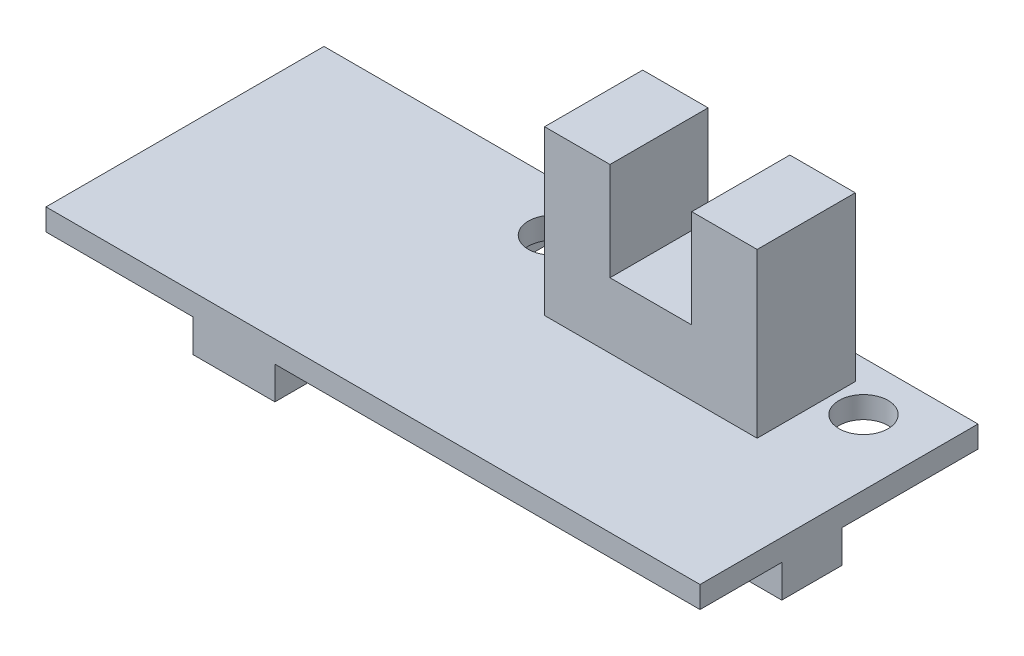
ISO-10303-21;
HEADER;
FILE_DESCRIPTION(('STEP AP214'),'2;1');
FILE_NAME('part.step','',(''),(''),'','','');
FILE_SCHEMA(('AUTOMOTIVE_DESIGN { 1 0 10303 214 1 1 1 1 }'));
ENDSEC;
DATA;
#1=APPLICATION_CONTEXT('core data for automotive mechanical design processes');
#2=APPLICATION_PROTOCOL_DEFINITION('international standard','automotive_design',2000,#1);
#3=PRODUCT_CONTEXT('',#1,'mechanical');
#4=PRODUCT('Part','Part','',(#3));
#5=PRODUCT_RELATED_PRODUCT_CATEGORY('part','',(#4));
#6=PRODUCT_DEFINITION_FORMATION('','',#4);
#7=PRODUCT_DEFINITION_CONTEXT('part definition',#1,'design');
#8=PRODUCT_DEFINITION('design','',#6,#7);
#9=PRODUCT_DEFINITION_SHAPE('','',#8);
#10=(LENGTH_UNIT() NAMED_UNIT(*) SI_UNIT(.MILLI.,.METRE.));
#11=(NAMED_UNIT(*) PLANE_ANGLE_UNIT() SI_UNIT($,.RADIAN.));
#12=(NAMED_UNIT(*) SI_UNIT($,.STERADIAN.) SOLID_ANGLE_UNIT());
#13=UNCERTAINTY_MEASURE_WITH_UNIT(LENGTH_MEASURE(1.E-05),#10,'distance_accuracy_value','');
#14=(GEOMETRIC_REPRESENTATION_CONTEXT(3) GLOBAL_UNCERTAINTY_ASSIGNED_CONTEXT((#13)) GLOBAL_UNIT_ASSIGNED_CONTEXT((#10,
#11,#12)) REPRESENTATION_CONTEXT('',''));
#15=CARTESIAN_POINT('',(0.,0.,0.));
#16=DIRECTION('',(0.,0.,1.));
#17=DIRECTION('',(1.,0.,0.));
#18=AXIS2_PLACEMENT_3D('',#15,#16,#17);
#19=CARTESIAN_POINT('',(0.,1.33,0.));
#20=DIRECTION('',(0.,1.,0.));
#21=DIRECTION('',(0.,0.,1.));
#22=AXIS2_PLACEMENT_3D('',#19,#20,#21);
#23=PLANE('',#22);
#24=CARTESIAN_POINT('',(-2.99999999999998,1.33,-5.5));
#25=DIRECTION('',(0.,-1.,0.));
#26=DIRECTION('',(0.,0.,-1.));
#27=AXIS2_PLACEMENT_3D('',#24,#25,#26);
#28=CIRCLE('',#27,1.5);
#29=CARTESIAN_POINT('',(-2.99999999999998,1.33,-7.));
#30=VERTEX_POINT('',#29);
#31=EDGE_CURVE('E255',#30,#30,#28,.T.);
#32=ORIENTED_EDGE('',*,*,#31,.T.);
#33=EDGE_LOOP('',(#32));
#34=FACE_BOUND('',#33,.T.);
#35=CARTESIAN_POINT('',(16.,1.33,-5.5));
#36=DIRECTION('',(0.,-1.,0.));
#37=DIRECTION('',(0.,0.,-1.));
#38=AXIS2_PLACEMENT_3D('',#35,#36,#37);
#39=CIRCLE('',#38,1.5);
#40=CARTESIAN_POINT('',(16.,1.33,-7.));
#41=VERTEX_POINT('',#40);
#42=EDGE_CURVE('E261',#41,#41,#39,.T.);
#43=ORIENTED_EDGE('',*,*,#42,.T.);
#44=EDGE_LOOP('',(#43));
#45=FACE_BOUND('',#44,.T.);
#46=DIRECTION('',(0.,0.,-1.));
#47=VECTOR('',#46,1.);
#48=CARTESIAN_POINT('',(20.,1.33,-8.5));
#49=LINE('',#48,#47);
#50=CARTESIAN_POINT('',(20.,1.33,8.5));
#51=VERTEX_POINT('',#50);
#52=CARTESIAN_POINT('',(20.,1.33,-8.5));
#53=VERTEX_POINT('',#52);
#54=EDGE_CURVE('E338',#51,#53,#49,.T.);
#55=ORIENTED_EDGE('',*,*,#54,.T.);
#56=DIRECTION('',(-1.,0.,0.));
#57=VECTOR('',#56,1.);
#58=CARTESIAN_POINT('',(-20.,1.33,-8.5));
#59=LINE('',#58,#57);
#60=CARTESIAN_POINT('',(-20.,1.33,-8.5));
#61=VERTEX_POINT('',#60);
#62=EDGE_CURVE('E341',#53,#61,#59,.T.);
#63=ORIENTED_EDGE('',*,*,#62,.T.);
#64=DIRECTION('',(0.,0.,1.));
#65=VECTOR('',#64,1.);
#66=CARTESIAN_POINT('',(-20.,1.33,-8.5));
#67=LINE('',#66,#65);
#68=CARTESIAN_POINT('',(-20.,1.33,8.5));
#69=VERTEX_POINT('',#68);
#70=EDGE_CURVE('E344',#61,#69,#67,.T.);
#71=ORIENTED_EDGE('',*,*,#70,.T.);
#72=DIRECTION('',(1.,0.,0.));
#73=VECTOR('',#72,1.);
#74=CARTESIAN_POINT('',(-20.,1.33,8.5));
#75=LINE('',#74,#73);
#76=EDGE_CURVE('E346',#69,#51,#75,.T.);
#77=ORIENTED_EDGE('',*,*,#76,.T.);
#78=EDGE_LOOP('',(#55,#63,#71,#77));
#79=FACE_BOUND('',#78,.T.);
#80=DIRECTION('',(0.,0.,1.));
#81=VECTOR('',#80,1.);
#82=CARTESIAN_POINT('',(1.00000000000002,1.33,-6.99296777077052));
#83=LINE('',#82,#81);
#84=CARTESIAN_POINT('',(1.00000000000002,1.33,-6.99296777077052));
#85=VERTEX_POINT('',#84);
#86=CARTESIAN_POINT('',(1.00000000000002,1.33,-0.992967770770519));
#87=VERTEX_POINT('',#86);
#88=EDGE_CURVE('E220',#85,#87,#83,.T.);
#89=ORIENTED_EDGE('',*,*,#88,.F.);
#90=DIRECTION('',(-1.,0.,0.));
#91=VECTOR('',#90,1.);
#92=CARTESIAN_POINT('',(14.,1.33,-6.99296777077052));
#93=LINE('',#92,#91);
#94=CARTESIAN_POINT('',(14.,1.33,-6.99296777077052));
#95=VERTEX_POINT('',#94);
#96=EDGE_CURVE('E228',#95,#85,#93,.T.);
#97=ORIENTED_EDGE('',*,*,#96,.F.);
#98=DIRECTION('',(0.,0.,-1.));
#99=VECTOR('',#98,1.);
#100=CARTESIAN_POINT('',(14.,1.33,-6.99296777077052));
#101=LINE('',#100,#99);
#102=CARTESIAN_POINT('',(14.,1.33,-0.99296777077052));
#103=VERTEX_POINT('',#102);
#104=EDGE_CURVE('E225',#103,#95,#101,.T.);
#105=ORIENTED_EDGE('',*,*,#104,.F.);
#106=DIRECTION('',(1.,0.,0.));
#107=VECTOR('',#106,1.);
#108=CARTESIAN_POINT('',(14.,1.33,-0.99296777077052));
#109=LINE('',#108,#107);
#110=EDGE_CURVE('E238',#87,#103,#109,.T.);
#111=ORIENTED_EDGE('',*,*,#110,.F.);
#112=EDGE_LOOP('',(#89,#97,#105,#111));
#113=FACE_BOUND('',#112,.T.);
#114=ADVANCED_FACE('F61',(#34,#45,#79,#113),#23,.T.);
#115=CARTESIAN_POINT('',(10.,11.33,-6.99296777077052));
#116=DIRECTION('',(1.,0.,0.));
#117=DIRECTION('',(0.,0.,-1.));
#118=AXIS2_PLACEMENT_3D('',#115,#116,#117);
#119=PLANE('',#118);
#120=DIRECTION('',(0.,0.,-1.));
#121=VECTOR('',#120,1.);
#122=CARTESIAN_POINT('',(10.,5.33,-6.99296777077052));
#123=LINE('',#122,#121);
#124=CARTESIAN_POINT('',(10.,5.33,-0.99296777077052));
#125=VERTEX_POINT('',#124);
#126=CARTESIAN_POINT('',(10.,5.33,-6.99296777077052));
#127=VERTEX_POINT('',#126);
#128=EDGE_CURVE('E83',#125,#127,#123,.T.);
#129=ORIENTED_EDGE('',*,*,#128,.F.);
#130=DIRECTION('',(0.,-1.,0.));
#131=VECTOR('',#130,1.);
#132=CARTESIAN_POINT('',(10.,11.33,-0.99296777077052));
#133=LINE('',#132,#131);
#134=CARTESIAN_POINT('',(10.,11.33,-0.99296777077052));
#135=VERTEX_POINT('',#134);
#136=EDGE_CURVE('E249',#135,#125,#133,.T.);
#137=ORIENTED_EDGE('',*,*,#136,.F.);
#138=DIRECTION('',(0.,0.,1.));
#139=VECTOR('',#138,1.);
#140=CARTESIAN_POINT('',(10.,11.33,-6.99296777077052));
#141=LINE('',#140,#139);
#142=CARTESIAN_POINT('',(10.,11.33,-6.99296777077052));
#143=VERTEX_POINT('',#142);
#144=EDGE_CURVE('E240',#143,#135,#141,.T.);
#145=ORIENTED_EDGE('',*,*,#144,.F.);
#146=DIRECTION('',(0.,-1.,0.));
#147=VECTOR('',#146,1.);
#148=CARTESIAN_POINT('',(10.,11.33,-6.99296777077052));
#149=LINE('',#148,#147);
#150=EDGE_CURVE('E78',#143,#127,#149,.T.);
#151=ORIENTED_EDGE('',*,*,#150,.T.);
#152=EDGE_LOOP('',(#129,#137,#145,#151));
#153=FACE_BOUND('',#152,.T.);
#154=ADVANCED_FACE('F436',(#153),#119,.F.);
#155=CARTESIAN_POINT('',(5.00000000000002,11.33,-6.99296777077052));
#156=DIRECTION('',(-1.,0.,0.));
#157=DIRECTION('',(0.,0.,1.));
#158=AXIS2_PLACEMENT_3D('',#155,#156,#157);
#159=PLANE('',#158);
#160=DIRECTION('',(0.,0.,1.));
#161=VECTOR('',#160,1.);
#162=CARTESIAN_POINT('',(5.00000000000002,5.33,-6.99296777077052));
#163=LINE('',#162,#161);
#164=CARTESIAN_POINT('',(5.00000000000002,5.33,-6.99296777077052));
#165=VERTEX_POINT('',#164);
#166=CARTESIAN_POINT('',(5.00000000000002,5.33,-0.992967770770519));
#167=VERTEX_POINT('',#166);
#168=EDGE_CURVE('E224',#165,#167,#163,.T.);
#169=ORIENTED_EDGE('',*,*,#168,.F.);
#170=DIRECTION('',(0.,-1.,0.));
#171=VECTOR('',#170,1.);
#172=CARTESIAN_POINT('',(5.00000000000002,11.33,-6.99296777077052));
#173=LINE('',#172,#171);
#174=CARTESIAN_POINT('',(5.00000000000002,11.33,-6.99296777077052));
#175=VERTEX_POINT('',#174);
#176=EDGE_CURVE('E205',#175,#165,#173,.T.);
#177=ORIENTED_EDGE('',*,*,#176,.F.);
#178=DIRECTION('',(0.,0.,-1.));
#179=VECTOR('',#178,1.);
#180=CARTESIAN_POINT('',(5.00000000000002,11.33,-6.99296777077052));
#181=LINE('',#180,#179);
#182=CARTESIAN_POINT('',(5.00000000000002,11.33,-0.992967770770519));
#183=VERTEX_POINT('',#182);
#184=EDGE_CURVE('E212',#183,#175,#181,.T.);
#185=ORIENTED_EDGE('',*,*,#184,.F.);
#186=DIRECTION('',(0.,-1.,0.));
#187=VECTOR('',#186,1.);
#188=CARTESIAN_POINT('',(5.00000000000002,11.33,-0.992967770770519));
#189=LINE('',#188,#187);
#190=EDGE_CURVE('E687',#183,#167,#189,.T.);
#191=ORIENTED_EDGE('',*,*,#190,.T.);
#192=EDGE_LOOP('',(#169,#177,#185,#191));
#193=FACE_BOUND('',#192,.T.);
#194=ADVANCED_FACE('F222',(#193),#159,.F.);
#195=CARTESIAN_POINT('',(0.,0.,0.));
#196=DIRECTION('',(0.,1.,0.));
#197=DIRECTION('',(0.,0.,1.));
#198=AXIS2_PLACEMENT_3D('',#195,#196,#197);
#199=PLANE('',#198);
#200=DIRECTION('',(0.,0.,1.));
#201=VECTOR('',#200,1.);
#202=CARTESIAN_POINT('',(-5.99999999999998,0.,0.));
#203=LINE('',#202,#201);
#204=CARTESIAN_POINT('',(-5.99999999999997,0.,3.5));
#205=VERTEX_POINT('',#204);
#206=CARTESIAN_POINT('',(-5.99999999999998,0.,8.5));
#207=VERTEX_POINT('',#206);
#208=EDGE_CURVE('E285',#205,#207,#203,.T.);
#209=ORIENTED_EDGE('',*,*,#208,.F.);
#210=DIRECTION('',(-1.,0.,0.));
#211=VECTOR('',#210,1.);
#212=CARTESIAN_POINT('',(20.,0.,3.5));
#213=LINE('',#212,#211);
#214=CARTESIAN_POINT('',(20.,0.,3.5));
#215=VERTEX_POINT('',#214);
#216=EDGE_CURVE('E264',#215,#205,#213,.T.);
#217=ORIENTED_EDGE('',*,*,#216,.F.);
#218=DIRECTION('',(0.,0.,-1.));
#219=VECTOR('',#218,1.);
#220=CARTESIAN_POINT('',(20.,0.,-8.5));
#221=LINE('',#220,#219);
#222=CARTESIAN_POINT('',(20.,0.,8.5));
#223=VERTEX_POINT('',#222);
#224=EDGE_CURVE('E358',#223,#215,#221,.T.);
#225=ORIENTED_EDGE('',*,*,#224,.F.);
#226=DIRECTION('',(1.,0.,0.));
#227=VECTOR('',#226,1.);
#228=CARTESIAN_POINT('',(-20.,0.,8.5));
#229=LINE('',#228,#227);
#230=EDGE_CURVE('E373',#207,#223,#229,.T.);
#231=ORIENTED_EDGE('',*,*,#230,.F.);
#232=EDGE_LOOP('',(#209,#217,#225,#231));
#233=FACE_BOUND('',#232,.T.);
#234=ADVANCED_FACE('F416',(#233),#199,.F.);
#235=DIRECTION('',(-1.,0.,0.));
#236=VECTOR('',#235,1.);
#237=CARTESIAN_POINT('',(-20.,0.,-8.5));
#238=LINE('',#237,#236);
#239=CARTESIAN_POINT('',(-11.,0.,-8.5));
#240=VERTEX_POINT('',#239);
#241=CARTESIAN_POINT('',(-20.,0.,-8.5));
#242=VERTEX_POINT('',#241);
#243=EDGE_CURVE('E360',#240,#242,#238,.T.);
#244=ORIENTED_EDGE('',*,*,#243,.F.);
#245=DIRECTION('',(0.,0.,1.));
#246=VECTOR('',#245,1.);
#247=CARTESIAN_POINT('',(-11.,0.,0.));
#248=LINE('',#247,#246);
#249=CARTESIAN_POINT('',(-11.,0.,8.5));
#250=VERTEX_POINT('',#249);
#251=EDGE_CURVE('E289',#240,#250,#248,.T.);
#252=ORIENTED_EDGE('',*,*,#251,.T.);
#253=CARTESIAN_POINT('',(-20.,0.,8.5));
#254=VERTEX_POINT('',#253);
#255=EDGE_CURVE('E342',#254,#250,#229,.T.);
#256=ORIENTED_EDGE('',*,*,#255,.F.);
#257=DIRECTION('',(0.,0.,1.));
#258=VECTOR('',#257,1.);
#259=CARTESIAN_POINT('',(-20.,0.,-8.5));
#260=LINE('',#259,#258);
#261=EDGE_CURVE('E370',#242,#254,#260,.T.);
#262=ORIENTED_EDGE('',*,*,#261,.F.);
#263=EDGE_LOOP('',(#244,#252,#256,#262));
#264=FACE_BOUND('',#263,.T.);
#265=ADVANCED_FACE('F450',(#264),#199,.F.);
#266=CARTESIAN_POINT('',(20.,1.33,-8.5));
#267=DIRECTION('',(-1.,0.,0.));
#268=DIRECTION('',(0.,0.,1.));
#269=AXIS2_PLACEMENT_3D('',#266,#267,#268);
#270=PLANE('',#269);
#271=ORIENTED_EDGE('',*,*,#224,.T.);
#272=DIRECTION('',(0.,1.,0.));
#273=VECTOR('',#272,1.);
#274=CARTESIAN_POINT('',(20.,-2.,3.5));
#275=LINE('',#274,#273);
#276=CARTESIAN_POINT('',(20.,-2.,3.5));
#277=VERTEX_POINT('',#276);
#278=EDGE_CURVE('E296',#277,#215,#275,.T.);
#279=ORIENTED_EDGE('',*,*,#278,.F.);
#280=DIRECTION('',(0.,0.,1.));
#281=VECTOR('',#280,1.);
#282=CARTESIAN_POINT('',(20.,-2.,-0.189999999999996));
#283=LINE('',#282,#281);
#284=CARTESIAN_POINT('',(20.,-2.,-0.189999999999996));
#285=VERTEX_POINT('',#284);
#286=EDGE_CURVE('E326',#285,#277,#283,.T.);
#287=ORIENTED_EDGE('',*,*,#286,.F.);
#288=DIRECTION('',(0.,1.,0.));
#289=VECTOR('',#288,1.);
#290=CARTESIAN_POINT('',(20.,-2.,-0.189999999999996));
#291=LINE('',#290,#289);
#292=CARTESIAN_POINT('',(20.,0.,-0.189999999999997));
#293=VERTEX_POINT('',#292);
#294=EDGE_CURVE('E312',#285,#293,#291,.T.);
#295=ORIENTED_EDGE('',*,*,#294,.T.);
#296=CARTESIAN_POINT('',(20.,0.,-8.5));
#297=VERTEX_POINT('',#296);
#298=EDGE_CURVE('E355',#293,#297,#221,.T.);
#299=ORIENTED_EDGE('',*,*,#298,.T.);
#300=DIRECTION('',(0.,-1.,0.));
#301=VECTOR('',#300,1.);
#302=CARTESIAN_POINT('',(20.,1.33,-8.5));
#303=LINE('',#302,#301);
#304=EDGE_CURVE('E12',#53,#297,#303,.T.);
#305=ORIENTED_EDGE('',*,*,#304,.F.);
#306=ORIENTED_EDGE('',*,*,#54,.F.);
#307=DIRECTION('',(0.,-1.,0.));
#308=VECTOR('',#307,1.);
#309=CARTESIAN_POINT('',(20.,1.33,8.5));
#310=LINE('',#309,#308);
#311=EDGE_CURVE('E348',#51,#223,#310,.T.);
#312=ORIENTED_EDGE('',*,*,#311,.T.);
#313=EDGE_LOOP('',(#271,#279,#287,#295,#299,#305,#306,#312));
#314=FACE_BOUND('',#313,.T.);
#315=ADVANCED_FACE('F63',(#314),#270,.F.);
#316=CARTESIAN_POINT('',(-20.,1.33,-8.5));
#317=DIRECTION('',(0.,0.,1.));
#318=DIRECTION('',(1.,0.,0.));
#319=AXIS2_PLACEMENT_3D('',#316,#317,#318);
#320=PLANE('',#319);
#321=CARTESIAN_POINT('',(-5.99999999999998,0.,-8.5));
#322=VERTEX_POINT('',#321);
#323=EDGE_CURVE('E380',#297,#322,#238,.T.);
#324=ORIENTED_EDGE('',*,*,#323,.T.);
#325=DIRECTION('',(0.,1.,0.));
#326=VECTOR('',#325,1.);
#327=CARTESIAN_POINT('',(-5.99999999999998,-2.,-8.5));
#328=LINE('',#327,#326);
#329=CARTESIAN_POINT('',(-5.99999999999998,-2.,-8.5));
#330=VERTEX_POINT('',#329);
#331=EDGE_CURVE('E307',#330,#322,#328,.T.);
#332=ORIENTED_EDGE('',*,*,#331,.F.);
#333=DIRECTION('',(1.,0.,0.));
#334=VECTOR('',#333,1.);
#335=CARTESIAN_POINT('',(0.,-2.,-8.5));
#336=LINE('',#335,#334);
#337=CARTESIAN_POINT('',(-11.,-2.,-8.5));
#338=VERTEX_POINT('',#337);
#339=EDGE_CURVE('E270',#338,#330,#336,.T.);
#340=ORIENTED_EDGE('',*,*,#339,.F.);
#341=DIRECTION('',(0.,1.,0.));
#342=VECTOR('',#341,1.);
#343=CARTESIAN_POINT('',(-11.,-2.,-8.5));
#344=LINE('',#343,#342);
#345=EDGE_CURVE('E392',#338,#240,#344,.T.);
#346=ORIENTED_EDGE('',*,*,#345,.T.);
#347=ORIENTED_EDGE('',*,*,#243,.T.);
#348=DIRECTION('',(0.,-1.,0.));
#349=VECTOR('',#348,1.);
#350=CARTESIAN_POINT('',(-20.,1.33,-8.5));
#351=LINE('',#350,#349);
#352=EDGE_CURVE('E70',#61,#242,#351,.T.);
#353=ORIENTED_EDGE('',*,*,#352,.F.);
#354=ORIENTED_EDGE('',*,*,#62,.F.);
#355=ORIENTED_EDGE('',*,*,#304,.T.);
#356=EDGE_LOOP('',(#324,#332,#340,#346,#347,#353,#354,#355));
#357=FACE_BOUND('',#356,.T.);
#358=ADVANCED_FACE('F427',(#357),#320,.F.);
#359=CARTESIAN_POINT('',(-20.,1.33,-8.5));
#360=DIRECTION('',(1.,0.,0.));
#361=DIRECTION('',(0.,0.,-1.));
#362=AXIS2_PLACEMENT_3D('',#359,#360,#361);
#363=PLANE('',#362);
#364=ORIENTED_EDGE('',*,*,#261,.T.);
#365=DIRECTION('',(0.,-1.,0.));
#366=VECTOR('',#365,1.);
#367=CARTESIAN_POINT('',(-20.,1.33,8.5));
#368=LINE('',#367,#366);
#369=EDGE_CURVE('E364',#69,#254,#368,.T.);
#370=ORIENTED_EDGE('',*,*,#369,.F.);
#371=ORIENTED_EDGE('',*,*,#70,.F.);
#372=ORIENTED_EDGE('',*,*,#352,.T.);
#373=EDGE_LOOP('',(#364,#370,#371,#372));
#374=FACE_BOUND('',#373,.T.);
#375=ADVANCED_FACE('F425',(#374),#363,.F.);
#376=CARTESIAN_POINT('',(-20.,1.33,8.5));
#377=DIRECTION('',(0.,0.,-1.));
#378=DIRECTION('',(-1.,0.,0.));
#379=AXIS2_PLACEMENT_3D('',#376,#377,#378);
#380=PLANE('',#379);
#381=ORIENTED_EDGE('',*,*,#255,.T.);
#382=DIRECTION('',(0.,1.,0.));
#383=VECTOR('',#382,1.);
#384=CARTESIAN_POINT('',(-11.,-2.,8.5));
#385=LINE('',#384,#383);
#386=CARTESIAN_POINT('',(-11.,-2.,8.5));
#387=VERTEX_POINT('',#386);
#388=EDGE_CURVE('E299',#387,#250,#385,.T.);
#389=ORIENTED_EDGE('',*,*,#388,.F.);
#390=DIRECTION('',(-1.,0.,0.));
#391=VECTOR('',#390,1.);
#392=CARTESIAN_POINT('',(0.,-2.,8.5));
#393=LINE('',#392,#391);
#394=CARTESIAN_POINT('',(-5.99999999999998,-2.,8.5));
#395=VERTEX_POINT('',#394);
#396=EDGE_CURVE('E276',#395,#387,#393,.T.);
#397=ORIENTED_EDGE('',*,*,#396,.F.);
#398=DIRECTION('',(0.,1.,0.));
#399=VECTOR('',#398,1.);
#400=CARTESIAN_POINT('',(-5.99999999999998,-2.,8.5));
#401=LINE('',#400,#399);
#402=EDGE_CURVE('E302',#395,#207,#401,.T.);
#403=ORIENTED_EDGE('',*,*,#402,.T.);
#404=ORIENTED_EDGE('',*,*,#230,.T.);
#405=ORIENTED_EDGE('',*,*,#311,.F.);
#406=ORIENTED_EDGE('',*,*,#76,.F.);
#407=ORIENTED_EDGE('',*,*,#369,.T.);
#408=EDGE_LOOP('',(#381,#389,#397,#403,#404,#405,#406,#407));
#409=FACE_BOUND('',#408,.T.);
#410=ADVANCED_FACE('F420',(#409),#380,.F.);
#411=CARTESIAN_POINT('',(-2.99999999999998,0.,-5.5));
#412=DIRECTION('',(0.,-1.,0.));
#413=DIRECTION('',(0.,0.,-1.));
#414=AXIS2_PLACEMENT_3D('',#411,#412,#413);
#415=CIRCLE('',#414,1.5);
#416=CARTESIAN_POINT('',(-2.99999999999998,0.,-7.));
#417=VERTEX_POINT('',#416);
#418=EDGE_CURVE('E254',#417,#417,#415,.T.);
#419=ORIENTED_EDGE('',*,*,#418,.F.);
#420=EDGE_LOOP('',(#419));
#421=FACE_BOUND('',#420,.T.);
#422=CARTESIAN_POINT('',(16.,0.,-5.5));
#423=DIRECTION('',(0.,-1.,0.));
#424=DIRECTION('',(0.,0.,-1.));
#425=AXIS2_PLACEMENT_3D('',#422,#423,#424);
#426=CIRCLE('',#425,1.5);
#427=CARTESIAN_POINT('',(16.,0.,-7.));
#428=VERTEX_POINT('',#427);
#429=EDGE_CURVE('E258',#428,#428,#426,.T.);
#430=ORIENTED_EDGE('',*,*,#429,.F.);
#431=EDGE_LOOP('',(#430));
#432=FACE_BOUND('',#431,.T.);
#433=ORIENTED_EDGE('',*,*,#298,.F.);
#434=DIRECTION('',(-1.,0.,0.));
#435=VECTOR('',#434,1.);
#436=CARTESIAN_POINT('',(20.,0.,-0.189999999999996));
#437=LINE('',#436,#435);
#438=CARTESIAN_POINT('',(-5.99999999999998,0.,-0.189999999999999));
#439=VERTEX_POINT('',#438);
#440=EDGE_CURVE('E334',#293,#439,#437,.T.);
#441=ORIENTED_EDGE('',*,*,#440,.T.);
#442=EDGE_CURVE('E271',#322,#439,#203,.T.);
#443=ORIENTED_EDGE('',*,*,#442,.F.);
#444=ORIENTED_EDGE('',*,*,#323,.F.);
#445=EDGE_LOOP('',(#433,#441,#443,#444));
#446=FACE_BOUND('',#445,.T.);
#447=ADVANCED_FACE('F433',(#421,#432,#446),#199,.F.);
#448=CARTESIAN_POINT('',(-11.,-2.,0.));
#449=DIRECTION('',(-1.,0.,0.));
#450=DIRECTION('',(0.,0.,1.));
#451=AXIS2_PLACEMENT_3D('',#448,#449,#450);
#452=PLANE('',#451);
#453=ORIENTED_EDGE('',*,*,#251,.F.);
#454=ORIENTED_EDGE('',*,*,#345,.F.);
#455=DIRECTION('',(0.,0.,1.));
#456=VECTOR('',#455,1.);
#457=CARTESIAN_POINT('',(-11.,-2.,0.));
#458=LINE('',#457,#456);
#459=EDGE_CURVE('E267',#338,#387,#458,.T.);
#460=ORIENTED_EDGE('',*,*,#459,.T.);
#461=ORIENTED_EDGE('',*,*,#388,.T.);
#462=EDGE_LOOP('',(#453,#454,#460,#461));
#463=FACE_BOUND('',#462,.T.);
#464=ADVANCED_FACE('F448',(#463),#452,.T.);
#465=CARTESIAN_POINT('',(0.,-2.,0.));
#466=DIRECTION('',(0.,-1.,0.));
#467=DIRECTION('',(0.,0.,-1.));
#468=AXIS2_PLACEMENT_3D('',#465,#466,#467);
#469=PLANE('',#468);
#470=ORIENTED_EDGE('',*,*,#459,.F.);
#471=ORIENTED_EDGE('',*,*,#339,.T.);
#472=DIRECTION('',(0.,0.,1.));
#473=VECTOR('',#472,1.);
#474=CARTESIAN_POINT('',(-5.99999999999998,-2.,0.));
#475=LINE('',#474,#473);
#476=CARTESIAN_POINT('',(-5.99999999999998,-2.,-0.189999999999999));
#477=VERTEX_POINT('',#476);
#478=EDGE_CURVE('E282',#330,#477,#475,.T.);
#479=ORIENTED_EDGE('',*,*,#478,.T.);
#480=DIRECTION('',(-1.,0.,0.));
#481=VECTOR('',#480,1.);
#482=CARTESIAN_POINT('',(20.,-2.,-0.189999999999996));
#483=LINE('',#482,#481);
#484=EDGE_CURVE('E315',#285,#477,#483,.T.);
#485=ORIENTED_EDGE('',*,*,#484,.F.);
#486=ORIENTED_EDGE('',*,*,#286,.T.);
#487=DIRECTION('',(-1.,0.,0.));
#488=VECTOR('',#487,1.);
#489=CARTESIAN_POINT('',(20.,-2.,3.5));
#490=LINE('',#489,#488);
#491=CARTESIAN_POINT('',(-5.99999999999998,-2.,3.5));
#492=VERTEX_POINT('',#491);
#493=EDGE_CURVE('E320',#277,#492,#490,.T.);
#494=ORIENTED_EDGE('',*,*,#493,.T.);
#495=EDGE_CURVE('E273',#492,#395,#475,.T.);
#496=ORIENTED_EDGE('',*,*,#495,.T.);
#497=ORIENTED_EDGE('',*,*,#396,.T.);
#498=EDGE_LOOP('',(#470,#471,#479,#485,#486,#494,#496,#497));
#499=FACE_BOUND('',#498,.T.);
#500=ADVANCED_FACE('F454',(#499),#469,.T.);
#501=CARTESIAN_POINT('',(-5.99999999999998,-2.,0.));
#502=DIRECTION('',(-1.,0.,0.));
#503=DIRECTION('',(0.,0.,1.));
#504=AXIS2_PLACEMENT_3D('',#501,#502,#503);
#505=PLANE('',#504);
#506=ORIENTED_EDGE('',*,*,#495,.F.);
#507=DIRECTION('',(0.,1.,0.));
#508=VECTOR('',#507,1.);
#509=CARTESIAN_POINT('',(-5.99999999999998,-2.,3.5));
#510=LINE('',#509,#508);
#511=EDGE_CURVE('E395',#492,#205,#510,.T.);
#512=ORIENTED_EDGE('',*,*,#511,.T.);
#513=ORIENTED_EDGE('',*,*,#208,.T.);
#514=ORIENTED_EDGE('',*,*,#402,.F.);
#515=EDGE_LOOP('',(#506,#512,#513,#514));
#516=FACE_BOUND('',#515,.T.);
#517=ADVANCED_FACE('F474',(#516),#505,.F.);
#518=DIRECTION('',(0.,1.,0.));
#519=VECTOR('',#518,1.);
#520=CARTESIAN_POINT('',(-5.99999999999998,-2.,-0.189999999999999));
#521=LINE('',#520,#519);
#522=EDGE_CURVE('E399',#477,#439,#521,.T.);
#523=ORIENTED_EDGE('',*,*,#522,.F.);
#524=ORIENTED_EDGE('',*,*,#478,.F.);
#525=ORIENTED_EDGE('',*,*,#331,.T.);
#526=ORIENTED_EDGE('',*,*,#442,.T.);
#527=EDGE_LOOP('',(#523,#524,#525,#526));
#528=FACE_BOUND('',#527,.T.);
#529=ADVANCED_FACE('F468',(#528),#505,.F.);
#530=CARTESIAN_POINT('',(20.,-2.,3.5));
#531=DIRECTION('',(0.,0.,-1.));
#532=DIRECTION('',(-1.,0.,0.));
#533=AXIS2_PLACEMENT_3D('',#530,#531,#532);
#534=PLANE('',#533);
#535=ORIENTED_EDGE('',*,*,#216,.T.);
#536=ORIENTED_EDGE('',*,*,#511,.F.);
#537=ORIENTED_EDGE('',*,*,#493,.F.);
#538=ORIENTED_EDGE('',*,*,#278,.T.);
#539=EDGE_LOOP('',(#535,#536,#537,#538));
#540=FACE_BOUND('',#539,.T.);
#541=ADVANCED_FACE('F412',(#540),#534,.F.);
#542=CARTESIAN_POINT('',(20.,-2.,-0.189999999999996));
#543=DIRECTION('',(0.,0.,-1.));
#544=DIRECTION('',(-1.,0.,0.));
#545=AXIS2_PLACEMENT_3D('',#542,#543,#544);
#546=PLANE('',#545);
#547=ORIENTED_EDGE('',*,*,#440,.F.);
#548=ORIENTED_EDGE('',*,*,#294,.F.);
#549=ORIENTED_EDGE('',*,*,#484,.T.);
#550=ORIENTED_EDGE('',*,*,#522,.T.);
#551=EDGE_LOOP('',(#547,#548,#549,#550));
#552=FACE_BOUND('',#551,.T.);
#553=ADVANCED_FACE('F484',(#552),#546,.T.);
#554=CARTESIAN_POINT('',(16.,1.33,-5.5));
#555=DIRECTION('',(0.,-1.,0.));
#556=DIRECTION('',(0.,0.,-1.));
#557=AXIS2_PLACEMENT_3D('',#554,#555,#556);
#558=CYLINDRICAL_SURFACE('',#557,1.5);
#559=ORIENTED_EDGE('',*,*,#42,.F.);
#560=EDGE_LOOP('',(#559));
#561=FACE_BOUND('',#560,.T.);
#562=ORIENTED_EDGE('',*,*,#429,.T.);
#563=EDGE_LOOP('',(#562));
#564=FACE_BOUND('',#563,.T.);
#565=ADVANCED_FACE('F486',(#561,#564),#558,.F.);
#566=CARTESIAN_POINT('',(-2.99999999999998,1.33,-5.5));
#567=DIRECTION('',(0.,-1.,0.));
#568=DIRECTION('',(0.,0.,-1.));
#569=AXIS2_PLACEMENT_3D('',#566,#567,#568);
#570=CYLINDRICAL_SURFACE('',#569,1.5);
#571=ORIENTED_EDGE('',*,*,#31,.F.);
#572=EDGE_LOOP('',(#571));
#573=FACE_BOUND('',#572,.T.);
#574=ORIENTED_EDGE('',*,*,#418,.T.);
#575=EDGE_LOOP('',(#574));
#576=FACE_BOUND('',#575,.T.);
#577=ADVANCED_FACE('F491',(#573,#576),#570,.F.);
#578=CARTESIAN_POINT('',(14.,11.33,-6.99296777077052));
#579=DIRECTION('',(-1.,0.,0.));
#580=DIRECTION('',(0.,0.,1.));
#581=AXIS2_PLACEMENT_3D('',#578,#579,#580);
#582=PLANE('',#581);
#583=ORIENTED_EDGE('',*,*,#104,.T.);
#584=DIRECTION('',(0.,-1.,0.));
#585=VECTOR('',#584,1.);
#586=CARTESIAN_POINT('',(14.,11.33,-6.99296777077052));
#587=LINE('',#586,#585);
#588=CARTESIAN_POINT('',(14.,11.33,-6.99296777077052));
#589=VERTEX_POINT('',#588);
#590=EDGE_CURVE('E252',#589,#95,#587,.T.);
#591=ORIENTED_EDGE('',*,*,#590,.F.);
#592=DIRECTION('',(0.,0.,-1.));
#593=VECTOR('',#592,1.);
#594=CARTESIAN_POINT('',(14.,11.33,-6.99296777077052));
#595=LINE('',#594,#593);
#596=CARTESIAN_POINT('',(14.,11.33,-0.99296777077052));
#597=VERTEX_POINT('',#596);
#598=EDGE_CURVE('E234',#597,#589,#595,.T.);
#599=ORIENTED_EDGE('',*,*,#598,.F.);
#600=DIRECTION('',(0.,-1.,0.));
#601=VECTOR('',#600,1.);
#602=CARTESIAN_POINT('',(14.,11.33,-0.99296777077052));
#603=LINE('',#602,#601);
#604=EDGE_CURVE('E243',#597,#103,#603,.T.);
#605=ORIENTED_EDGE('',*,*,#604,.T.);
#606=EDGE_LOOP('',(#583,#591,#599,#605));
#607=FACE_BOUND('',#606,.T.);
#608=ADVANCED_FACE('F583',(#607),#582,.F.);
#609=CARTESIAN_POINT('',(14.,11.33,-6.99296777077052));
#610=DIRECTION('',(0.,0.,1.));
#611=DIRECTION('',(1.,0.,0.));
#612=AXIS2_PLACEMENT_3D('',#609,#610,#611);
#613=PLANE('',#612);
#614=ORIENTED_EDGE('',*,*,#96,.T.);
#615=DIRECTION('',(0.,-1.,0.));
#616=VECTOR('',#615,1.);
#617=CARTESIAN_POINT('',(1.00000000000002,11.33,-6.99296777077052));
#618=LINE('',#617,#616);
#619=CARTESIAN_POINT('',(1.00000000000002,11.33,-6.99296777077052));
#620=VERTEX_POINT('',#619);
#621=EDGE_CURVE('E208',#620,#85,#618,.T.);
#622=ORIENTED_EDGE('',*,*,#621,.F.);
#623=DIRECTION('',(-1.,0.,0.));
#624=VECTOR('',#623,1.);
#625=CARTESIAN_POINT('',(5.00000000000002,11.33,-6.99296777077052));
#626=LINE('',#625,#624);
#627=EDGE_CURVE('E201',#175,#620,#626,.T.);
#628=ORIENTED_EDGE('',*,*,#627,.F.);
#629=ORIENTED_EDGE('',*,*,#176,.T.);
#630=DIRECTION('',(-1.,0.,0.));
#631=VECTOR('',#630,1.);
#632=CARTESIAN_POINT('',(10.,5.33,-6.99296777077052));
#633=LINE('',#632,#631);
#634=EDGE_CURVE('E677',#127,#165,#633,.T.);
#635=ORIENTED_EDGE('',*,*,#634,.F.);
#636=ORIENTED_EDGE('',*,*,#150,.F.);
#637=DIRECTION('',(-1.,0.,0.));
#638=VECTOR('',#637,1.);
#639=CARTESIAN_POINT('',(14.,11.33,-6.99296777077052));
#640=LINE('',#639,#638);
#641=EDGE_CURVE('E237',#589,#143,#640,.T.);
#642=ORIENTED_EDGE('',*,*,#641,.F.);
#643=ORIENTED_EDGE('',*,*,#590,.T.);
#644=EDGE_LOOP('',(#614,#622,#628,#629,#635,#636,#642,#643));
#645=FACE_BOUND('',#644,.T.);
#646=ADVANCED_FACE('F203',(#645),#613,.F.);
#647=CARTESIAN_POINT('',(14.,11.33,-0.99296777077052));
#648=DIRECTION('',(0.,0.,-1.));
#649=DIRECTION('',(-1.,0.,0.));
#650=AXIS2_PLACEMENT_3D('',#647,#648,#649);
#651=PLANE('',#650);
#652=ORIENTED_EDGE('',*,*,#110,.T.);
#653=ORIENTED_EDGE('',*,*,#604,.F.);
#654=DIRECTION('',(1.,0.,0.));
#655=VECTOR('',#654,1.);
#656=CARTESIAN_POINT('',(14.,11.33,-0.99296777077052));
#657=LINE('',#656,#655);
#658=EDGE_CURVE('E242',#135,#597,#657,.T.);
#659=ORIENTED_EDGE('',*,*,#658,.F.);
#660=ORIENTED_EDGE('',*,*,#136,.T.);
#661=DIRECTION('',(1.,0.,0.));
#662=VECTOR('',#661,1.);
#663=CARTESIAN_POINT('',(10.,5.33,-0.99296777077052));
#664=LINE('',#663,#662);
#665=EDGE_CURVE('E679',#167,#125,#664,.T.);
#666=ORIENTED_EDGE('',*,*,#665,.F.);
#667=ORIENTED_EDGE('',*,*,#190,.F.);
#668=DIRECTION('',(1.,0.,0.));
#669=VECTOR('',#668,1.);
#670=CARTESIAN_POINT('',(5.00000000000002,11.33,-0.992967770770519));
#671=LINE('',#670,#669);
#672=CARTESIAN_POINT('',(1.00000000000002,11.33,-0.992967770770519));
#673=VERTEX_POINT('',#672);
#674=EDGE_CURVE('E217',#673,#183,#671,.T.);
#675=ORIENTED_EDGE('',*,*,#674,.F.);
#676=DIRECTION('',(0.,-1.,0.));
#677=VECTOR('',#676,1.);
#678=CARTESIAN_POINT('',(1.00000000000002,11.33,-0.992967770770519));
#679=LINE('',#678,#677);
#680=EDGE_CURVE('E230',#673,#87,#679,.T.);
#681=ORIENTED_EDGE('',*,*,#680,.T.);
#682=EDGE_LOOP('',(#652,#653,#659,#660,#666,#667,#675,#681));
#683=FACE_BOUND('',#682,.T.);
#684=ADVANCED_FACE('F606',(#683),#651,.F.);
#685=CARTESIAN_POINT('',(0.,11.33,0.));
#686=DIRECTION('',(0.,-1.,0.));
#687=DIRECTION('',(0.,0.,-1.));
#688=AXIS2_PLACEMENT_3D('',#685,#686,#687);
#689=PLANE('',#688);
#690=ORIENTED_EDGE('',*,*,#598,.T.);
#691=ORIENTED_EDGE('',*,*,#641,.T.);
#692=ORIENTED_EDGE('',*,*,#144,.T.);
#693=ORIENTED_EDGE('',*,*,#658,.T.);
#694=EDGE_LOOP('',(#690,#691,#692,#693));
#695=FACE_BOUND('',#694,.T.);
#696=ADVANCED_FACE('F600',(#695),#689,.F.);
#697=CARTESIAN_POINT('',(1.00000000000002,11.33,-6.99296777077052));
#698=DIRECTION('',(1.,0.,0.));
#699=DIRECTION('',(0.,0.,-1.));
#700=AXIS2_PLACEMENT_3D('',#697,#698,#699);
#701=PLANE('',#700);
#702=ORIENTED_EDGE('',*,*,#88,.T.);
#703=ORIENTED_EDGE('',*,*,#680,.F.);
#704=DIRECTION('',(0.,0.,1.));
#705=VECTOR('',#704,1.);
#706=CARTESIAN_POINT('',(1.00000000000002,11.33,-6.99296777077052));
#707=LINE('',#706,#705);
#708=EDGE_CURVE('E211',#620,#673,#707,.T.);
#709=ORIENTED_EDGE('',*,*,#708,.F.);
#710=ORIENTED_EDGE('',*,*,#621,.T.);
#711=EDGE_LOOP('',(#702,#703,#709,#710));
#712=FACE_BOUND('',#711,.T.);
#713=ADVANCED_FACE('F605',(#712),#701,.F.);
#714=CARTESIAN_POINT('',(0.,11.33,0.));
#715=DIRECTION('',(0.,-1.,0.));
#716=DIRECTION('',(0.,0.,-1.));
#717=AXIS2_PLACEMENT_3D('',#714,#715,#716);
#718=PLANE('',#717);
#719=ORIENTED_EDGE('',*,*,#184,.T.);
#720=ORIENTED_EDGE('',*,*,#627,.T.);
#721=ORIENTED_EDGE('',*,*,#708,.T.);
#722=ORIENTED_EDGE('',*,*,#674,.T.);
#723=EDGE_LOOP('',(#719,#720,#721,#722));
#724=FACE_BOUND('',#723,.T.);
#725=ADVANCED_FACE('F215',(#724),#718,.F.);
#726=CARTESIAN_POINT('',(0.,5.33,0.));
#727=DIRECTION('',(0.,-1.,0.));
#728=DIRECTION('',(0.,0.,-1.));
#729=AXIS2_PLACEMENT_3D('',#726,#727,#728);
#730=PLANE('',#729);
#731=ORIENTED_EDGE('',*,*,#128,.T.);
#732=ORIENTED_EDGE('',*,*,#634,.T.);
#733=ORIENTED_EDGE('',*,*,#168,.T.);
#734=ORIENTED_EDGE('',*,*,#665,.T.);
#735=EDGE_LOOP('',(#731,#732,#733,#734));
#736=FACE_BOUND('',#735,.T.);
#737=ADVANCED_FACE('F627',(#736),#730,.F.);
#738=CLOSED_SHELL('',(#114,#154,#194,#234,#265,#315,#358,#375,#410,#447,#464,#500,#517,#529,
#541,#553,#565,#577,#608,#646,#684,#696,#713,#725,#737));
#739=MANIFOLD_SOLID_BREP('B2',#738);
#740=ADVANCED_BREP_SHAPE_REPRESENTATION('',(#18,#739),#14);
#741=SHAPE_DEFINITION_REPRESENTATION(#9,#740);
ENDSEC;
END-ISO-10303-21;
